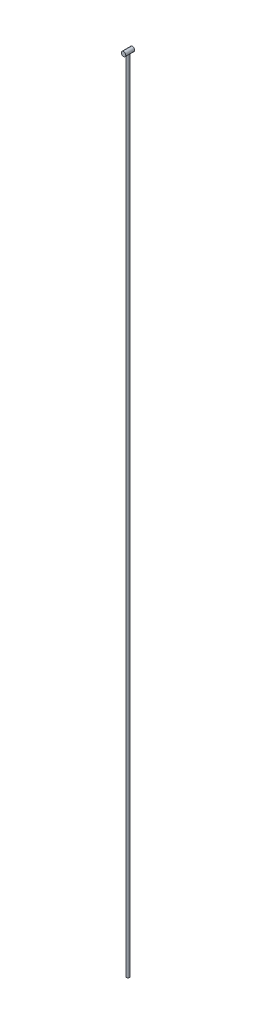
ISO-10303-21;
HEADER;
FILE_DESCRIPTION(('STEP AP214'),'2;1');
FILE_NAME('part.step','',(''),(''),'','','');
FILE_SCHEMA(('AUTOMOTIVE_DESIGN { 1 0 10303 214 1 1 1 1 }'));
ENDSEC;
DATA;
#1=APPLICATION_CONTEXT('core data for automotive mechanical design processes');
#2=APPLICATION_PROTOCOL_DEFINITION('international standard','automotive_design',2000,#1);
#3=PRODUCT_CONTEXT('',#1,'mechanical');
#4=PRODUCT('Part','Part','',(#3));
#5=PRODUCT_RELATED_PRODUCT_CATEGORY('part','',(#4));
#6=PRODUCT_DEFINITION_FORMATION('','',#4);
#7=PRODUCT_DEFINITION_CONTEXT('part definition',#1,'design');
#8=PRODUCT_DEFINITION('design','',#6,#7);
#9=PRODUCT_DEFINITION_SHAPE('','',#8);
#10=(LENGTH_UNIT() NAMED_UNIT(*) SI_UNIT(.MILLI.,.METRE.));
#11=(NAMED_UNIT(*) PLANE_ANGLE_UNIT() SI_UNIT($,.RADIAN.));
#12=(NAMED_UNIT(*) SI_UNIT($,.STERADIAN.) SOLID_ANGLE_UNIT());
#13=UNCERTAINTY_MEASURE_WITH_UNIT(LENGTH_MEASURE(1.E-05),#10,'distance_accuracy_value','');
#14=(GEOMETRIC_REPRESENTATION_CONTEXT(3) GLOBAL_UNCERTAINTY_ASSIGNED_CONTEXT((#13)) GLOBAL_UNIT_ASSIGNED_CONTEXT((#10,
#11,#12)) REPRESENTATION_CONTEXT('',''));
#15=CARTESIAN_POINT('',(0.,0.,0.));
#16=DIRECTION('',(0.,0.,1.));
#17=DIRECTION('',(1.,0.,0.));
#18=AXIS2_PLACEMENT_3D('',#15,#16,#17);
#19=CARTESIAN_POINT('',(0.,900.,-10.));
#20=DIRECTION('',(0.,0.,-1.));
#21=DIRECTION('',(0.,-1.,0.));
#22=AXIS2_PLACEMENT_3D('',#19,#20,#21);
#23=PLANE('',#22);
#24=CARTESIAN_POINT('',(0.,900.,-10.));
#25=DIRECTION('',(0.,0.,-1.));
#26=DIRECTION('',(1.,0.,0.));
#27=AXIS2_PLACEMENT_3D('',#24,#25,#26);
#28=CIRCLE('',#27,5.);
#29=CARTESIAN_POINT('',(5.,900.,-10.));
#30=VERTEX_POINT('',#29);
#31=EDGE_CURVE('E10',#30,#30,#28,.T.);
#32=ORIENTED_EDGE('',*,*,#31,.T.);
#33=EDGE_LOOP('',(#32));
#34=FACE_BOUND('',#33,.T.);
#35=ADVANCED_FACE('F15',(#34),#23,.T.);
#36=CARTESIAN_POINT('',(0.,900.,10.));
#37=DIRECTION('',(0.,0.,-1.));
#38=DIRECTION('',(0.,-1.,0.));
#39=AXIS2_PLACEMENT_3D('',#36,#37,#38);
#40=PLANE('',#39);
#41=CARTESIAN_POINT('',(0.,900.,10.));
#42=DIRECTION('',(0.,0.,-1.));
#43=DIRECTION('',(1.,0.,0.));
#44=AXIS2_PLACEMENT_3D('',#41,#42,#43);
#45=CIRCLE('',#44,5.);
#46=CARTESIAN_POINT('',(5.,900.,10.));
#47=VERTEX_POINT('',#46);
#48=EDGE_CURVE('E28',#47,#47,#45,.T.);
#49=ORIENTED_EDGE('',*,*,#48,.F.);
#50=EDGE_LOOP('',(#49));
#51=FACE_BOUND('',#50,.T.);
#52=ADVANCED_FACE('F65',(#51),#40,.F.);
#53=CARTESIAN_POINT('',(0.,900.,10.));
#54=DIRECTION('',(0.,0.,-1.));
#55=DIRECTION('',(-1.,0.,0.));
#56=AXIS2_PLACEMENT_3D('',#53,#54,#55);
#57=CYLINDRICAL_SURFACE('',#56,5.);
#58=ORIENTED_EDGE('',*,*,#31,.F.);
#59=EDGE_LOOP('',(#58));
#60=FACE_BOUND('',#59,.T.);
#61=ORIENTED_EDGE('',*,*,#48,.T.);
#62=EDGE_LOOP('',(#61));
#63=FACE_BOUND('',#62,.T.);
#64=CARTESIAN_POINT('',(0.,895.,3.));
#65=CARTESIAN_POINT('',(-0.0767697294351693,895.000000924536,2.99999894375546));
#66=CARTESIAN_POINT('',(-0.153562134518389,895.001774321877,2.99704640642993));
#67=CARTESIAN_POINT('',(-0.306548487758722,895.008816374294,2.98528576702026));
#68=CARTESIAN_POINT('',(-0.382742059346601,895.01408707446,2.97647423881177));
#69=CARTESIAN_POINT('',(-0.609808130024629,895.035006546475,2.94135144053687));
#70=CARTESIAN_POINT('',(-0.758981863291681,895.055762274286,2.90635229756656));
#71=CARTESIAN_POINT('',(-1.04754167363584,895.108767610041,2.81522725649588));
#72=CARTESIAN_POINT('',(-1.18697226741339,895.140960204489,2.75920607798727));
#73=CARTESIAN_POINT('',(-1.45405042800212,895.214092977442,2.62827933940299));
#74=CARTESIAN_POINT('',(-1.58170090938256,895.255030983853,2.55337846763988));
#75=CARTESIAN_POINT('',(-1.83260160381824,895.345892687166,2.38045034488487));
#76=CARTESIAN_POINT('',(-1.95476885986173,895.396264129581,2.28109260883339));
#77=CARTESIAN_POINT('',(-2.18176458748066,895.499391240941,2.06506559280775));
#78=CARTESIAN_POINT('',(-2.28657046750404,895.552149904425,1.94837412578165));
#79=CARTESIAN_POINT('',(-2.48890019509833,895.661778651667,1.68415297883113));
#80=CARTESIAN_POINT('',(-2.58395539627839,895.718359643642,1.53459645787782));
#81=CARTESIAN_POINT('',(-2.74722868670787,895.821233974039,1.21830685367309));
#82=CARTESIAN_POINT('',(-2.8154903315581,895.867543955251,1.05160220796684));
#83=CARTESIAN_POINT('',(-2.90881204577223,895.932907406228,0.746807098343121));
#84=CARTESIAN_POINT('',(-2.94032394587636,895.955842336614,0.611528001638639));
#85=CARTESIAN_POINT('',(-2.98432344587083,895.988193834724,0.336392569478639));
#86=CARTESIAN_POINT('',(-2.99683469884359,895.997627209106,0.196542146695994));
#87=CARTESIAN_POINT('',(-3.0021101681982,896.001581548737,-0.0840229926478408));
#88=CARTESIAN_POINT('',(-2.99483563630785,895.996073252433,-0.224738865911854));
#89=CARTESIAN_POINT('',(-2.96092124146105,895.970934778444,-0.502557535117835));
#90=CARTESIAN_POINT('',(-2.93426681225442,895.951293978652,-0.639657532941456));
#91=CARTESIAN_POINT('',(-2.86347831933194,895.900936234171,-0.905060542250499));
#92=CARTESIAN_POINT('',(-2.81957453422892,895.870365667,-1.03345432299442));
#93=CARTESIAN_POINT('',(-2.71590167467071,895.80145907297,-1.28138976663178));
#94=CARTESIAN_POINT('',(-2.65612678414159,895.763120200586,-1.40092816382902));
#95=CARTESIAN_POINT('',(-2.51035773820673,895.674893016345,-1.6499691376563));
#96=CARTESIAN_POINT('',(-2.42160671901875,895.624157364193,-1.77755999236764));
#97=CARTESIAN_POINT('',(-2.22582963207784,895.521389774759,-2.01734915722002));
#98=CARTESIAN_POINT('',(-2.11878609335506,895.469356639224,-2.12953256540209));
#99=CARTESIAN_POINT('',(-1.87159040921359,895.361282330371,-2.35124225944848));
#100=CARTESIAN_POINT('',(-1.72890315178778,895.305693180469,-2.45821939123729));
#101=CARTESIAN_POINT('',(-1.50061053630289,895.22981674005,-2.59926871272279));
#102=CARTESIAN_POINT('',(-1.42209821815692,895.205766847625,-2.64306413551604));
#103=CARTESIAN_POINT('',(-1.26074368673922,895.160835032436,-2.72371882361096));
#104=CARTESIAN_POINT('',(-1.17790417501182,895.139951164111,-2.76058235202078));
#105=CARTESIAN_POINT('',(-1.01376371174006,895.103173272551,-2.82481144285662));
#106=CARTESIAN_POINT('',(-0.932690066664036,895.087048995451,-2.85262656044918));
#107=CARTESIAN_POINT('',(-0.767879949732921,895.058608732053,-2.90133395584521));
#108=CARTESIAN_POINT('',(-0.684144997174727,895.046290614467,-2.92223010844634));
#109=CARTESIAN_POINT('',(-0.5147444626545,895.025836294851,-2.95677185472474));
#110=CARTESIAN_POINT('',(-0.429080341969677,895.017697031791,-2.9704227558286));
#111=CARTESIAN_POINT('',(-0.256621746592255,895.005840035856,-2.9902661843902));
#112=CARTESIAN_POINT('',(-0.169827432617798,895.002121681103,-2.99645976085132));
#113=CARTESIAN_POINT('',(0.0673242571106158,894.998208420452,-3.00299267028363));
#114=CARTESIAN_POINT('',(0.218056842610635,895.002534874282,-2.9958115456306));
#115=CARTESIAN_POINT('',(0.515686907628969,895.024420449799,-2.9591544582709));
#116=CARTESIAN_POINT('',(0.662584464852935,895.041979303156,-2.92967894765815));
#117=CARTESIAN_POINT('',(0.945142599254794,895.088105523443,-2.85091154081573));
#118=CARTESIAN_POINT('',(1.08098954856943,895.116394855703,-2.80211887340799));
#119=CARTESIAN_POINT('',(1.34253345184751,895.181722013717,-2.6866456757991));
#120=CARTESIAN_POINT('',(1.46822839746273,895.218761564847,-2.61996161740594));
#121=CARTESIAN_POINT('',(1.72001192130145,895.303090189407,-2.46288590902206));
#122=CARTESIAN_POINT('',(1.84478813824216,895.351043975931,-2.37075230616256));
#123=CARTESIAN_POINT('',(2.07805222548218,895.450514657741,-2.16921724874528));
#124=CARTESIAN_POINT('',(2.18652085154154,895.502035659566,-2.05979570039731));
#125=CARTESIAN_POINT('',(2.39863988264156,895.611091531643,-1.81017920850687));
#126=CARTESIAN_POINT('',(2.49982037884168,895.668535167698,-1.66783222605702));
#127=CARTESIAN_POINT('',(2.67690479207531,895.775676356044,-1.36556795387251));
#128=CARTESIAN_POINT('',(2.75283533845459,895.825382039386,-1.20566941284881));
#129=CARTESIAN_POINT('',(2.86285157351704,895.900301815707,-0.907513954889331));
#130=CARTESIAN_POINT('',(2.90243250662611,895.928486813661,-0.772039375358019));
#131=CARTESIAN_POINT('',(2.96227327821696,895.971807884894,-0.494935843764831));
#132=CARTESIAN_POINT('',(2.98255990395067,895.986962046721,-0.353315710548539));
#133=CARTESIAN_POINT('',(3.00268261034206,896.001991068101,-0.0672461056048279));
#134=CARTESIAN_POINT('',(3.00244179030845,896.001808472552,0.0772119782482648));
#135=CARTESIAN_POINT('',(2.98132945103106,895.986045640672,0.363788874346348));
#136=CARTESIAN_POINT('',(2.96044671369592,895.970457031763,0.505906371874734));
#137=CARTESIAN_POINT('',(2.90080351212234,895.927336300338,0.776976823995039));
#138=CARTESIAN_POINT('',(2.86295284328649,895.900415782844,0.906234147924323));
#139=CARTESIAN_POINT('',(2.77126473512033,895.837889941834,1.15667454965312));
#140=CARTESIAN_POINT('',(2.71742127517723,895.802281348525,1.27785456561293));
#141=CARTESIAN_POINT('',(2.58578536859701,895.719740270496,1.52863953945993));
#142=CARTESIAN_POINT('',(2.50558518231559,895.671908574203,1.65668150821473));
#143=CARTESIAN_POINT('',(2.3275121374696,895.573597133259,1.89876084530656));
#144=CARTESIAN_POINT('',(2.22962472612072,895.523115232509,2.01278655047949));
#145=CARTESIAN_POINT('',(2.00020353552563,895.415487617296,2.24269884332941));
#146=CARTESIAN_POINT('',(1.8657857179052,895.358599542614,2.35584987986156));
#147=CARTESIAN_POINT('',(1.57689277813442,895.25268570462,2.5582079860481));
#148=CARTESIAN_POINT('',(1.42241049573682,895.203662762105,2.64740647291968));
#149=CARTESIAN_POINT('',(1.1810218966169,895.140794416851,2.75912447419051));
#150=CARTESIAN_POINT('',(1.10025014285138,895.121828608147,2.79233599596448));
#151=CARTESIAN_POINT('',(0.935442217988403,895.087565862248,2.85177213814346));
#152=CARTESIAN_POINT('',(0.851407984788122,895.072266784635,2.87800083570093));
#153=CARTESIAN_POINT('',(0.681001816074584,895.04584472012,2.92300944207574));
#154=CARTESIAN_POINT('',(0.594637500609302,895.034709557681,2.9418110773033));
#155=CARTESIAN_POINT('',(0.420183746020796,895.016916813547,2.97174435532298));
#156=CARTESIAN_POINT('',(0.332095806784462,895.010255502762,2.9828823861533));
#157=CARTESIAN_POINT('',(0.203123929661396,895.003962715785,2.99339168380533));
#158=CARTESIAN_POINT('',(0.162556281113531,895.002478018208,2.995868430454));
#159=CARTESIAN_POINT('',(0.081327878186786,895.000496398307,2.99917289691394));
#160=CARTESIAN_POINT('',(0.0406671206271816,894.999999510247,3.00000055952293));
#161=CARTESIAN_POINT('',(0.,895.,3.));
#162=B_SPLINE_CURVE_WITH_KNOTS('',3,(#64,#65,#66,#67,#68,#69,#70,#71,#72,#73,#74,#75,#76,#77,
#78,#79,#80,#81,#82,#83,#84,#85,#86,#87,#88,#89,#90,#91,#92,#93,#94,#95,#96,#97,#98,#99,#100,
#101,#102,#103,#104,#105,#106,#107,#108,#109,#110,#111,#112,#113,#114,#115,#116,#117,#118,#119,
#120,#121,#122,#123,#124,#125,#126,#127,#128,#129,#130,#131,#132,#133,#134,#135,#136,#137,#138,
#139,#140,#141,#142,#143,#144,#145,#146,#147,#148,#149,#150,#151,#152,#153,#154,#155,#156,#157,
#158,#159,#160,#161),.UNSPECIFIED.,.T.,.F.,(4,2,2,2,2,2,2,2,2,2,2,2,2,2,2,2,2,2,2,2,2,2,2,2,2,2,
2,2,2,2,2,2,2,2,2,2,2,2,2,2,2,2,2,2,2,2,2,2,4),(0.,0.230263300595004,0.460661369333419,
0.922002149276092,1.38107466343605,1.8400332902207,2.33408870888566,2.82878205293225,
3.38413315803227,3.93857770807792,4.35913349134874,4.77916531256764,5.2000203116506,
5.62119195971354,6.0369222461002,6.45280509043336,6.9413967987392,7.43045779030941,
7.9876760519298,8.26653157143416,8.5452150301372,8.8064847358905,9.06760787545931,
9.32853946730951,9.58943435026952,10.0398406663533,10.4902378491739,10.9296843257003,
11.3692175250853,11.854355928272,12.3400624135414,12.8890638604649,13.4374844642339,
13.8674843581986,14.2968863865711,14.7278971274534,15.1591422350193,15.5696105785276,
15.9802336423654,16.4539008129505,16.9279594993089,17.4794148474151,18.0310675325444,
18.2988384573894,18.5664526907293,18.8332781687617,19.0998809626713,19.2218537856859,
19.3438308395352),.UNSPECIFIED.);
#163=CARTESIAN_POINT('',(0.,895.,3.));
#164=VERTEX_POINT('',#163);
#165=EDGE_CURVE('E18',#164,#164,#162,.F.);
#166=ORIENTED_EDGE('',*,*,#165,.T.);
#167=EDGE_LOOP('',(#166));
#168=FACE_BOUND('',#167,.T.);
#169=ADVANCED_FACE('F52',(#60,#63,#168),#57,.T.);
#170=CARTESIAN_POINT('',(0.,-900.,0.));
#171=DIRECTION('',(0.,1.,0.));
#172=DIRECTION('',(1.,0.,0.));
#173=AXIS2_PLACEMENT_3D('',#170,#171,#172);
#174=PLANE('',#173);
#175=CARTESIAN_POINT('',(0.,-900.,0.));
#176=DIRECTION('',(0.,1.,0.));
#177=DIRECTION('',(1.,0.,0.));
#178=AXIS2_PLACEMENT_3D('',#175,#176,#177);
#179=CIRCLE('',#178,3.);
#180=CARTESIAN_POINT('',(3.,-900.,0.));
#181=VERTEX_POINT('',#180);
#182=EDGE_CURVE('E37',#181,#181,#179,.T.);
#183=ORIENTED_EDGE('',*,*,#182,.F.);
#184=EDGE_LOOP('',(#183));
#185=FACE_BOUND('',#184,.T.);
#186=ADVANCED_FACE('F56',(#185),#174,.F.);
#187=CARTESIAN_POINT('',(0.,-900.,0.));
#188=DIRECTION('',(0.,1.,0.));
#189=DIRECTION('',(0.,0.,1.));
#190=AXIS2_PLACEMENT_3D('',#187,#188,#189);
#191=CYLINDRICAL_SURFACE('',#190,3.);
#192=ORIENTED_EDGE('',*,*,#182,.T.);
#193=EDGE_LOOP('',(#192));
#194=FACE_BOUND('',#193,.T.);
#195=ORIENTED_EDGE('',*,*,#165,.F.);
#196=EDGE_LOOP('',(#195));
#197=FACE_BOUND('',#196,.T.);
#198=ADVANCED_FACE('F54',(#194,#197),#191,.T.);
#199=CLOSED_SHELL('',(#35,#52,#169,#186,#198));
#200=MANIFOLD_SOLID_BREP('B1',#199);
#201=ADVANCED_BREP_SHAPE_REPRESENTATION('',(#18,#200),#14);
#202=SHAPE_DEFINITION_REPRESENTATION(#9,#201);
ENDSEC;
END-ISO-10303-21;
